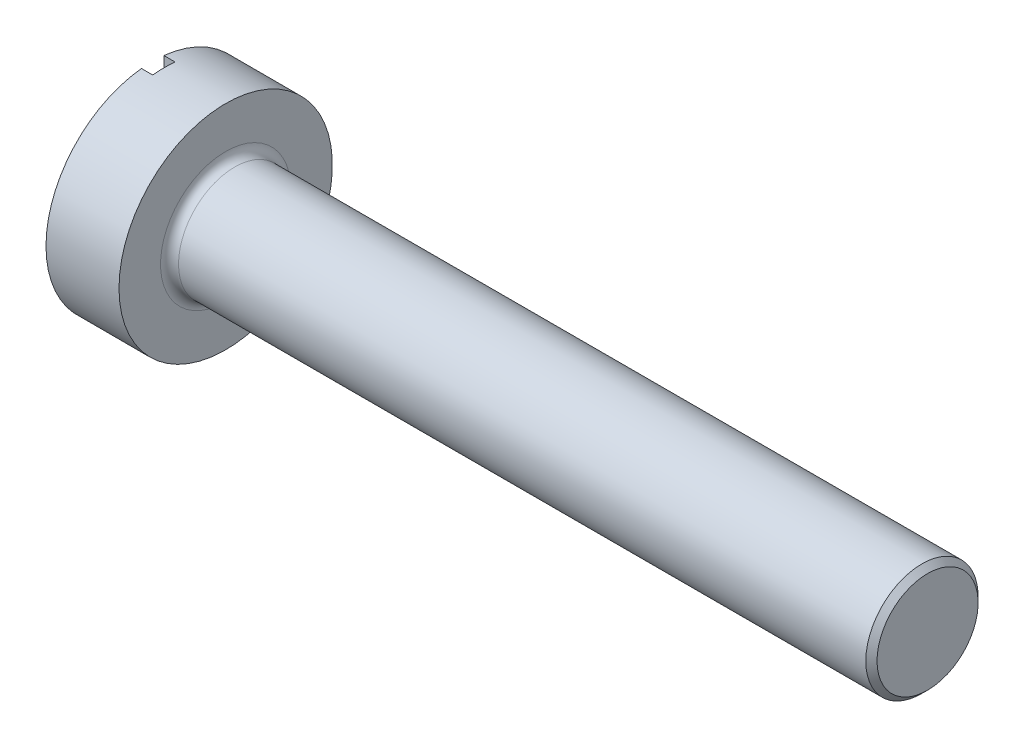
ISO-10303-21;
HEADER;
FILE_DESCRIPTION(('STEP AP214'),'2;1');
FILE_NAME('part.step','',(''),(''),'','','');
FILE_SCHEMA(('AUTOMOTIVE_DESIGN { 1 0 10303 214 1 1 1 1 }'));
ENDSEC;
DATA;
#1=APPLICATION_CONTEXT('core data for automotive mechanical design processes');
#2=APPLICATION_PROTOCOL_DEFINITION('international standard','automotive_design',2000,#1);
#3=PRODUCT_CONTEXT('',#1,'mechanical');
#4=PRODUCT('Part','Part','',(#3));
#5=PRODUCT_RELATED_PRODUCT_CATEGORY('part','',(#4));
#6=PRODUCT_DEFINITION_FORMATION('','',#4);
#7=PRODUCT_DEFINITION_CONTEXT('part definition',#1,'design');
#8=PRODUCT_DEFINITION('design','',#6,#7);
#9=PRODUCT_DEFINITION_SHAPE('','',#8);
#10=(LENGTH_UNIT() NAMED_UNIT(*) SI_UNIT(.MILLI.,.METRE.));
#11=(NAMED_UNIT(*) PLANE_ANGLE_UNIT() SI_UNIT($,.RADIAN.));
#12=(NAMED_UNIT(*) SI_UNIT($,.STERADIAN.) SOLID_ANGLE_UNIT());
#13=UNCERTAINTY_MEASURE_WITH_UNIT(LENGTH_MEASURE(1.E-05),#10,'distance_accuracy_value','');
#14=(GEOMETRIC_REPRESENTATION_CONTEXT(3) GLOBAL_UNCERTAINTY_ASSIGNED_CONTEXT((#13)) GLOBAL_UNIT_ASSIGNED_CONTEXT((#10,
#11,#12)) REPRESENTATION_CONTEXT('',''));
#15=CARTESIAN_POINT('',(0.,0.,0.));
#16=DIRECTION('',(0.,0.,1.));
#17=DIRECTION('',(1.,0.,0.));
#18=AXIS2_PLACEMENT_3D('',#15,#16,#17);
#19=CARTESIAN_POINT('',(0.,0.,0.));
#20=DIRECTION('',(-1.,0.,0.));
#21=DIRECTION('',(0.,0.,1.));
#22=AXIS2_PLACEMENT_3D('',#19,#20,#21);
#23=CYLINDRICAL_SURFACE('',#22,1.9);
#24=CARTESIAN_POINT('',(1.3,0.,0.));
#25=DIRECTION('',(-1.,0.,0.));
#26=DIRECTION('',(0.,0.,1.));
#27=AXIS2_PLACEMENT_3D('',#24,#25,#26);
#28=CIRCLE('',#27,1.9);
#29=CARTESIAN_POINT('',(1.3,0.,1.9));
#30=VERTEX_POINT('',#29);
#31=EDGE_CURVE('E92',#30,#30,#28,.T.);
#32=ORIENTED_EDGE('',*,*,#31,.T.);
#33=EDGE_LOOP('',(#32));
#34=FACE_BOUND('',#33,.T.);
#35=DIRECTION('',(-1.,0.,0.));
#36=VECTOR('',#35,1.);
#37=CARTESIAN_POINT('',(0.,-1.88944436276912,0.2));
#38=LINE('',#37,#36);
#39=CARTESIAN_POINT('',(0.2,-1.88944436276912,0.2));
#40=VERTEX_POINT('',#39);
#41=CARTESIAN_POINT('',(0.,-1.88944436276912,0.2));
#42=VERTEX_POINT('',#41);
#43=EDGE_CURVE('E122',#40,#42,#38,.T.);
#44=ORIENTED_EDGE('',*,*,#43,.F.);
#45=CARTESIAN_POINT('',(0.2,0.,0.));
#46=DIRECTION('',(-1.,0.,0.));
#47=DIRECTION('',(0.,0.,1.));
#48=AXIS2_PLACEMENT_3D('',#45,#46,#47);
#49=CIRCLE('',#48,1.9);
#50=CARTESIAN_POINT('',(0.2,-1.88944436276912,-0.2));
#51=VERTEX_POINT('',#50);
#52=EDGE_CURVE('E11',#40,#51,#49,.F.);
#53=ORIENTED_EDGE('',*,*,#52,.T.);
#54=DIRECTION('',(-1.,0.,0.));
#55=VECTOR('',#54,1.);
#56=CARTESIAN_POINT('',(0.,-1.88944436276912,-0.2));
#57=LINE('',#56,#55);
#58=CARTESIAN_POINT('',(0.,-1.88944436276912,-0.2));
#59=VERTEX_POINT('',#58);
#60=EDGE_CURVE('E79',#51,#59,#57,.T.);
#61=ORIENTED_EDGE('',*,*,#60,.T.);
#62=CARTESIAN_POINT('',(0.,0.,0.));
#63=DIRECTION('',(-1.,0.,0.));
#64=DIRECTION('',(0.,0.,1.));
#65=AXIS2_PLACEMENT_3D('',#62,#63,#64);
#66=CIRCLE('',#65,1.9);
#67=CARTESIAN_POINT('',(0.,1.88944436276912,-0.2));
#68=VERTEX_POINT('',#67);
#69=EDGE_CURVE('E88',#68,#59,#66,.T.);
#70=ORIENTED_EDGE('',*,*,#69,.F.);
#71=DIRECTION('',(-1.,0.,0.));
#72=VECTOR('',#71,1.);
#73=CARTESIAN_POINT('',(0.,1.88944436276912,-0.2));
#74=LINE('',#73,#72);
#75=CARTESIAN_POINT('',(0.2,1.88944436276912,-0.2));
#76=VERTEX_POINT('',#75);
#77=EDGE_CURVE('E52',#68,#76,#74,.F.);
#78=ORIENTED_EDGE('',*,*,#77,.T.);
#79=CARTESIAN_POINT('',(0.2,1.88944436276912,0.2));
#80=VERTEX_POINT('',#79);
#81=EDGE_CURVE('E41',#76,#80,#49,.F.);
#82=ORIENTED_EDGE('',*,*,#81,.T.);
#83=DIRECTION('',(-1.,0.,0.));
#84=VECTOR('',#83,1.);
#85=CARTESIAN_POINT('',(0.,1.88944436276912,0.2));
#86=LINE('',#85,#84);
#87=CARTESIAN_POINT('',(0.,1.88944436276912,0.2));
#88=VERTEX_POINT('',#87);
#89=EDGE_CURVE('E99',#88,#80,#86,.F.);
#90=ORIENTED_EDGE('',*,*,#89,.F.);
#91=EDGE_CURVE('E93',#42,#88,#66,.T.);
#92=ORIENTED_EDGE('',*,*,#91,.F.);
#93=EDGE_LOOP('',(#44,#53,#61,#70,#78,#82,#90,#92));
#94=FACE_BOUND('',#93,.T.);
#95=ADVANCED_FACE('F37',(#34,#94),#23,.T.);
#96=CARTESIAN_POINT('',(0.,0.,0.));
#97=DIRECTION('',(-1.,0.,0.));
#98=DIRECTION('',(0.,0.,1.));
#99=AXIS2_PLACEMENT_3D('',#96,#97,#98);
#100=PLANE('',#99);
#101=ORIENTED_EDGE('',*,*,#69,.T.);
#102=DIRECTION('',(0.,1.,0.));
#103=VECTOR('',#102,1.);
#104=CARTESIAN_POINT('',(0.,0.,-0.2));
#105=LINE('',#104,#103);
#106=EDGE_CURVE('E76',#59,#68,#105,.T.);
#107=ORIENTED_EDGE('',*,*,#106,.T.);
#108=EDGE_LOOP('',(#101,#107));
#109=FACE_BOUND('',#108,.T.);
#110=ADVANCED_FACE('F91',(#109),#100,.T.);
#111=CARTESIAN_POINT('',(13.8,0.,0.));
#112=DIRECTION('',(-1.,0.,0.));
#113=DIRECTION('',(0.,0.,1.));
#114=AXIS2_PLACEMENT_3D('',#111,#112,#113);
#115=PLANE('',#114);
#116=CARTESIAN_POINT('',(13.8,0.,0.));
#117=DIRECTION('',(-1.,0.,0.));
#118=DIRECTION('',(0.,0.,1.));
#119=AXIS2_PLACEMENT_3D('',#116,#117,#118);
#120=CIRCLE('',#119,0.899999999999995);
#121=CARTESIAN_POINT('',(13.8,0.,0.899999999999995));
#122=VERTEX_POINT('',#121);
#123=EDGE_CURVE('E105',#122,#122,#120,.F.);
#124=ORIENTED_EDGE('',*,*,#123,.T.);
#125=EDGE_LOOP('',(#124));
#126=FACE_BOUND('',#125,.T.);
#127=ADVANCED_FACE('F141',(#126),#115,.F.);
#128=CARTESIAN_POINT('',(0.,0.,0.));
#129=DIRECTION('',(-1.,0.,0.));
#130=DIRECTION('',(0.,0.,1.));
#131=AXIS2_PLACEMENT_3D('',#128,#129,#130);
#132=CYLINDRICAL_SURFACE('',#131,1.);
#133=CARTESIAN_POINT('',(1.46,0.,0.));
#134=DIRECTION('',(1.,0.,0.));
#135=DIRECTION('',(0.,0.,-1.));
#136=AXIS2_PLACEMENT_3D('',#133,#134,#135);
#137=CIRCLE('',#136,1.);
#138=CARTESIAN_POINT('',(1.46,0.,-1.));
#139=VERTEX_POINT('',#138);
#140=EDGE_CURVE('E84',#139,#139,#137,.T.);
#141=ORIENTED_EDGE('',*,*,#140,.T.);
#142=EDGE_LOOP('',(#141));
#143=FACE_BOUND('',#142,.T.);
#144=CARTESIAN_POINT('',(13.7,0.,0.));
#145=DIRECTION('',(-1.,0.,0.));
#146=DIRECTION('',(0.,0.,1.));
#147=AXIS2_PLACEMENT_3D('',#144,#145,#146);
#148=CIRCLE('',#147,1.);
#149=CARTESIAN_POINT('',(13.7,0.,1.));
#150=VERTEX_POINT('',#149);
#151=EDGE_CURVE('E96',#150,#150,#148,.T.);
#152=ORIENTED_EDGE('',*,*,#151,.T.);
#153=EDGE_LOOP('',(#152));
#154=FACE_BOUND('',#153,.T.);
#155=ADVANCED_FACE('F135',(#143,#154),#132,.T.);
#156=CARTESIAN_POINT('',(1.3,0.,0.));
#157=DIRECTION('',(1.,0.,0.));
#158=DIRECTION('',(0.,0.,-1.));
#159=AXIS2_PLACEMENT_3D('',#156,#157,#158);
#160=PLANE('',#159);
#161=CARTESIAN_POINT('',(1.3,0.,0.));
#162=DIRECTION('',(1.,0.,0.));
#163=DIRECTION('',(0.,0.,-1.));
#164=AXIS2_PLACEMENT_3D('',#161,#162,#163);
#165=CIRCLE('',#164,1.16);
#166=CARTESIAN_POINT('',(1.3,0.,-1.16));
#167=VERTEX_POINT('',#166);
#168=EDGE_CURVE('E108',#167,#167,#165,.F.);
#169=ORIENTED_EDGE('',*,*,#168,.T.);
#170=EDGE_LOOP('',(#169));
#171=FACE_BOUND('',#170,.T.);
#172=ORIENTED_EDGE('',*,*,#31,.F.);
#173=EDGE_LOOP('',(#172));
#174=FACE_BOUND('',#173,.T.);
#175=ADVANCED_FACE('F128',(#171,#174),#160,.T.);
#176=DIRECTION('',(0.,1.,0.));
#177=VECTOR('',#176,1.);
#178=CARTESIAN_POINT('',(0.,0.,0.2));
#179=LINE('',#178,#177);
#180=EDGE_CURVE('E60',#42,#88,#179,.T.);
#181=ORIENTED_EDGE('',*,*,#180,.F.);
#182=ORIENTED_EDGE('',*,*,#91,.T.);
#183=EDGE_LOOP('',(#181,#182));
#184=FACE_BOUND('',#183,.T.);
#185=ADVANCED_FACE('F125',(#184),#100,.T.);
#186=CARTESIAN_POINT('',(13.7,0.,0.));
#187=DIRECTION('',(-1.,0.,0.));
#188=DIRECTION('',(0.,0.,1.));
#189=AXIS2_PLACEMENT_3D('',#186,#187,#188);
#190=CONICAL_SURFACE('',#189,1.,0.78539816339745);
#191=ORIENTED_EDGE('',*,*,#123,.F.);
#192=EDGE_LOOP('',(#191));
#193=FACE_BOUND('',#192,.T.);
#194=ORIENTED_EDGE('',*,*,#151,.F.);
#195=EDGE_LOOP('',(#194));
#196=FACE_BOUND('',#195,.T.);
#197=ADVANCED_FACE('F127',(#193,#196),#190,.T.);
#198=CARTESIAN_POINT('',(1.46,0.,0.));
#199=DIRECTION('',(1.,0.,0.));
#200=DIRECTION('',(0.,0.,-1.));
#201=AXIS2_PLACEMENT_3D('',#198,#199,#200);
#202=TOROIDAL_SURFACE('',#201,1.16,0.16);
#203=ORIENTED_EDGE('',*,*,#140,.F.);
#204=EDGE_LOOP('',(#203));
#205=FACE_BOUND('',#204,.T.);
#206=ORIENTED_EDGE('',*,*,#168,.F.);
#207=EDGE_LOOP('',(#206));
#208=FACE_BOUND('',#207,.T.);
#209=ADVANCED_FACE('F39',(#205,#208),#202,.F.);
#210=CARTESIAN_POINT('',(0.2,-1.9,0.));
#211=DIRECTION('',(-1.,0.,0.));
#212=DIRECTION('',(0.,0.,1.));
#213=AXIS2_PLACEMENT_3D('',#210,#211,#212);
#214=PLANE('',#213);
#215=DIRECTION('',(0.,1.,0.));
#216=VECTOR('',#215,1.);
#217=CARTESIAN_POINT('',(0.2,-1.9,0.2));
#218=LINE('',#217,#216);
#219=EDGE_CURVE('E89',#40,#80,#218,.T.);
#220=ORIENTED_EDGE('',*,*,#219,.T.);
#221=ORIENTED_EDGE('',*,*,#81,.F.);
#222=DIRECTION('',(0.,1.,0.));
#223=VECTOR('',#222,1.);
#224=CARTESIAN_POINT('',(0.2,-1.9,-0.2));
#225=LINE('',#224,#223);
#226=EDGE_CURVE('E117',#51,#76,#225,.T.);
#227=ORIENTED_EDGE('',*,*,#226,.F.);
#228=ORIENTED_EDGE('',*,*,#52,.F.);
#229=EDGE_LOOP('',(#220,#221,#227,#228));
#230=FACE_BOUND('',#229,.T.);
#231=ADVANCED_FACE('F116',(#230),#214,.T.);
#232=CARTESIAN_POINT('',(0.,-1.9,0.2));
#233=DIRECTION('',(0.,0.,1.));
#234=DIRECTION('',(1.,0.,0.));
#235=AXIS2_PLACEMENT_3D('',#232,#233,#234);
#236=PLANE('',#235);
#237=ORIENTED_EDGE('',*,*,#89,.T.);
#238=ORIENTED_EDGE('',*,*,#219,.F.);
#239=ORIENTED_EDGE('',*,*,#43,.T.);
#240=ORIENTED_EDGE('',*,*,#180,.T.);
#241=EDGE_LOOP('',(#237,#238,#239,#240));
#242=FACE_BOUND('',#241,.T.);
#243=ADVANCED_FACE('F123',(#242),#236,.F.);
#244=CARTESIAN_POINT('',(0.,-1.9,-0.2));
#245=DIRECTION('',(0.,0.,1.));
#246=DIRECTION('',(1.,0.,0.));
#247=AXIS2_PLACEMENT_3D('',#244,#245,#246);
#248=PLANE('',#247);
#249=ORIENTED_EDGE('',*,*,#106,.F.);
#250=ORIENTED_EDGE('',*,*,#60,.F.);
#251=ORIENTED_EDGE('',*,*,#226,.T.);
#252=ORIENTED_EDGE('',*,*,#77,.F.);
#253=EDGE_LOOP('',(#249,#250,#251,#252));
#254=FACE_BOUND('',#253,.T.);
#255=ADVANCED_FACE('F78',(#254),#248,.T.);
#256=CLOSED_SHELL('',(#95,#110,#127,#155,#175,#185,#197,#209,#231,#243,#255));
#257=MANIFOLD_SOLID_BREP('B2',#256);
#258=ADVANCED_BREP_SHAPE_REPRESENTATION('',(#18,#257),#14);
#259=SHAPE_DEFINITION_REPRESENTATION(#9,#258);
ENDSEC;
END-ISO-10303-21;
